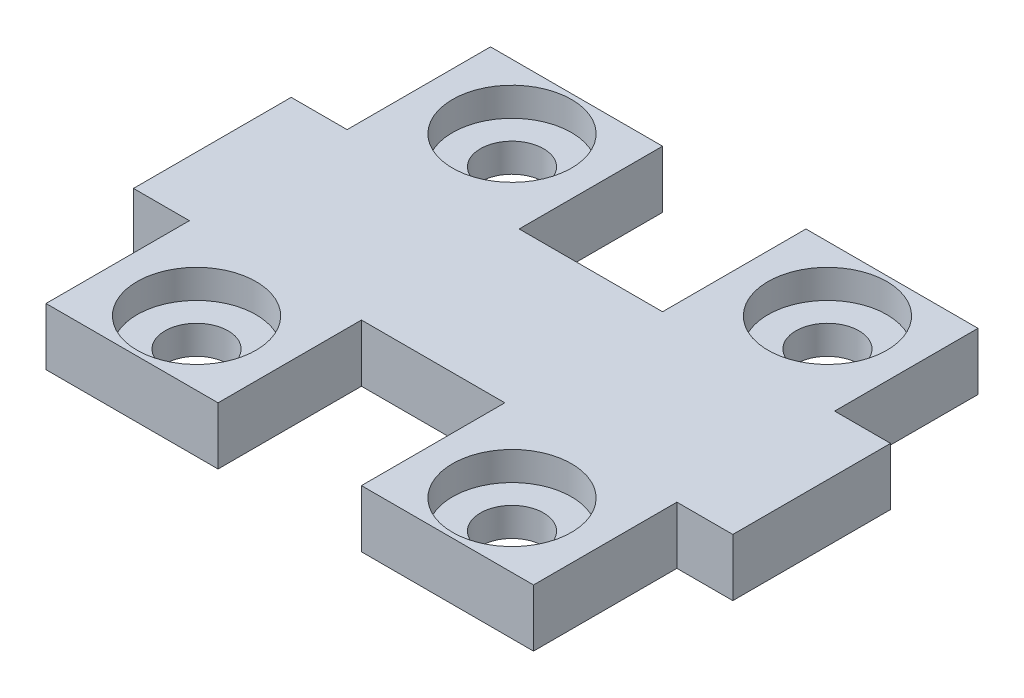
ISO-10303-21;
HEADER;
FILE_DESCRIPTION(('STEP AP214'),'2;1');
FILE_NAME('part.step','',(''),(''),'','','');
FILE_SCHEMA(('AUTOMOTIVE_DESIGN { 1 0 10303 214 1 1 1 1 }'));
ENDSEC;
DATA;
#1=APPLICATION_CONTEXT('core data for automotive mechanical design processes');
#2=APPLICATION_PROTOCOL_DEFINITION('international standard','automotive_design',2000,#1);
#3=PRODUCT_CONTEXT('',#1,'mechanical');
#4=PRODUCT('Part','Part','',(#3));
#5=PRODUCT_RELATED_PRODUCT_CATEGORY('part','',(#4));
#6=PRODUCT_DEFINITION_FORMATION('','',#4);
#7=PRODUCT_DEFINITION_CONTEXT('part definition',#1,'design');
#8=PRODUCT_DEFINITION('design','',#6,#7);
#9=PRODUCT_DEFINITION_SHAPE('','',#8);
#10=(LENGTH_UNIT() NAMED_UNIT(*) SI_UNIT(.MILLI.,.METRE.));
#11=(NAMED_UNIT(*) PLANE_ANGLE_UNIT() SI_UNIT($,.RADIAN.));
#12=(NAMED_UNIT(*) SI_UNIT($,.STERADIAN.) SOLID_ANGLE_UNIT());
#13=UNCERTAINTY_MEASURE_WITH_UNIT(LENGTH_MEASURE(1.E-05),#10,'distance_accuracy_value','');
#14=(GEOMETRIC_REPRESENTATION_CONTEXT(3) GLOBAL_UNCERTAINTY_ASSIGNED_CONTEXT((#13)) GLOBAL_UNIT_ASSIGNED_CONTEXT((#10,
#11,#12)) REPRESENTATION_CONTEXT('',''));
#15=CARTESIAN_POINT('',(0.,0.,0.));
#16=DIRECTION('',(0.,0.,1.));
#17=DIRECTION('',(1.,0.,0.));
#18=AXIS2_PLACEMENT_3D('',#15,#16,#17);
#19=CARTESIAN_POINT('',(58.9,4.,-13.0906004899504));
#20=DIRECTION('',(0.,1.,0.));
#21=DIRECTION('',(0.,0.,1.));
#22=AXIS2_PLACEMENT_3D('',#19,#20,#21);
#23=PLANE('',#22);
#24=DIRECTION('',(1.,0.,0.));
#25=VECTOR('',#24,1.);
#26=CARTESIAN_POINT('',(0.,4.,-13.0906004899504));
#27=LINE('',#26,#25);
#28=CARTESIAN_POINT('',(55.,4.,-13.0906004899504));
#29=VERTEX_POINT('',#28);
#30=CARTESIAN_POINT('',(58.9,4.,-13.0906004899504));
#31=VERTEX_POINT('',#30);
#32=EDGE_CURVE('E203',#29,#31,#27,.T.);
#33=ORIENTED_EDGE('',*,*,#32,.T.);
#34=DIRECTION('',(0.,0.,-1.));
#35=VECTOR('',#34,1.);
#36=CARTESIAN_POINT('',(58.9,4.,-3.09060048995041));
#37=LINE('',#36,#35);
#38=CARTESIAN_POINT('',(58.9,4.,-3.09060048995041));
#39=VERTEX_POINT('',#38);
#40=EDGE_CURVE('E239',#39,#31,#37,.T.);
#41=ORIENTED_EDGE('',*,*,#40,.F.);
#42=DIRECTION('',(-1.,0.,0.));
#43=VECTOR('',#42,1.);
#44=CARTESIAN_POINT('',(55.,4.,-3.09060048995041));
#45=LINE('',#44,#43);
#46=CARTESIAN_POINT('',(70.9,4.,-3.09060048995041));
#47=VERTEX_POINT('',#46);
#48=EDGE_CURVE('E321',#47,#39,#45,.T.);
#49=ORIENTED_EDGE('',*,*,#48,.F.);
#50=DIRECTION('',(0.,0.,1.));
#51=VECTOR('',#50,1.);
#52=CARTESIAN_POINT('',(70.9,4.,-13.0906004899504));
#53=LINE('',#52,#51);
#54=CARTESIAN_POINT('',(70.9,4.,-13.0906004899504));
#55=VERTEX_POINT('',#54);
#56=EDGE_CURVE('E277',#55,#47,#53,.T.);
#57=ORIENTED_EDGE('',*,*,#56,.F.);
#58=CARTESIAN_POINT('',(80.9,4.,-13.0906004899504));
#59=VERTEX_POINT('',#58);
#60=EDGE_CURVE('E201',#55,#59,#27,.T.);
#61=ORIENTED_EDGE('',*,*,#60,.T.);
#62=DIRECTION('',(0.,0.,-1.));
#63=VECTOR('',#62,1.);
#64=CARTESIAN_POINT('',(80.9,4.,-13.0906004899504));
#65=LINE('',#64,#63);
#66=CARTESIAN_POINT('',(80.9,4.,-3.09060048995041));
#67=VERTEX_POINT('',#66);
#68=EDGE_CURVE('E270',#67,#59,#65,.T.);
#69=ORIENTED_EDGE('',*,*,#68,.F.);
#70=CARTESIAN_POINT('',(92.9,4.,-3.09060048995041));
#71=VERTEX_POINT('',#70);
#72=EDGE_CURVE('E318',#71,#67,#45,.T.);
#73=ORIENTED_EDGE('',*,*,#72,.F.);
#74=DIRECTION('',(0.,0.,1.));
#75=VECTOR('',#74,1.);
#76=CARTESIAN_POINT('',(92.9,4.,-13.0906004899504));
#77=LINE('',#76,#75);
#78=CARTESIAN_POINT('',(92.9,4.,-13.0906004899504));
#79=VERTEX_POINT('',#78);
#80=EDGE_CURVE('E191',#79,#71,#77,.T.);
#81=ORIENTED_EDGE('',*,*,#80,.F.);
#82=CARTESIAN_POINT('',(96.8,4.,-13.0906004899504));
#83=VERTEX_POINT('',#82);
#84=EDGE_CURVE('E197',#79,#83,#27,.T.);
#85=ORIENTED_EDGE('',*,*,#84,.T.);
#86=DIRECTION('',(0.,0.,-1.));
#87=VECTOR('',#86,1.);
#88=CARTESIAN_POINT('',(96.8,4.,-3.09060048995041));
#89=LINE('',#88,#87);
#90=CARTESIAN_POINT('',(96.8,4.,-24.0906004899504));
#91=VERTEX_POINT('',#90);
#92=EDGE_CURVE('E196',#83,#91,#89,.T.);
#93=ORIENTED_EDGE('',*,*,#92,.T.);
#94=DIRECTION('',(-1.,0.,0.));
#95=VECTOR('',#94,1.);
#96=CARTESIAN_POINT('',(0.,4.,-24.0906004899504));
#97=LINE('',#96,#95);
#98=CARTESIAN_POINT('',(92.9,4.,-24.0906004899504));
#99=VERTEX_POINT('',#98);
#100=EDGE_CURVE('E186',#91,#99,#97,.T.);
#101=ORIENTED_EDGE('',*,*,#100,.T.);
#102=DIRECTION('',(0.,0.,1.));
#103=VECTOR('',#102,1.);
#104=CARTESIAN_POINT('',(92.9,4.,-34.0906004899504));
#105=LINE('',#104,#103);
#106=CARTESIAN_POINT('',(92.9,4.,-34.0906004899504));
#107=VERTEX_POINT('',#106);
#108=EDGE_CURVE('E169',#107,#99,#105,.T.);
#109=ORIENTED_EDGE('',*,*,#108,.F.);
#110=DIRECTION('',(-1.,0.,0.));
#111=VECTOR('',#110,1.);
#112=CARTESIAN_POINT('',(55.,4.,-34.0906004899504));
#113=LINE('',#112,#111);
#114=CARTESIAN_POINT('',(80.9,4.,-34.0906004899504));
#115=VERTEX_POINT('',#114);
#116=EDGE_CURVE('E357',#107,#115,#113,.T.);
#117=ORIENTED_EDGE('',*,*,#116,.T.);
#118=DIRECTION('',(0.,0.,-1.));
#119=VECTOR('',#118,1.);
#120=CARTESIAN_POINT('',(80.9,4.,-34.0906004899504));
#121=LINE('',#120,#119);
#122=CARTESIAN_POINT('',(80.9,4.,-24.0906004899504));
#123=VERTEX_POINT('',#122);
#124=EDGE_CURVE('E234',#123,#115,#121,.T.);
#125=ORIENTED_EDGE('',*,*,#124,.F.);
#126=CARTESIAN_POINT('',(70.9,4.,-24.0906004899504));
#127=VERTEX_POINT('',#126);
#128=EDGE_CURVE('E198',#123,#127,#97,.T.);
#129=ORIENTED_EDGE('',*,*,#128,.T.);
#130=DIRECTION('',(0.,0.,1.));
#131=VECTOR('',#130,1.);
#132=CARTESIAN_POINT('',(70.9,4.,-34.0906004899504));
#133=LINE('',#132,#131);
#134=CARTESIAN_POINT('',(70.9,4.,-34.0906004899504));
#135=VERTEX_POINT('',#134);
#136=EDGE_CURVE('E236',#135,#127,#133,.T.);
#137=ORIENTED_EDGE('',*,*,#136,.F.);
#138=CARTESIAN_POINT('',(58.9,4.,-34.0906004899504));
#139=VERTEX_POINT('',#138);
#140=EDGE_CURVE('E358',#135,#139,#113,.T.);
#141=ORIENTED_EDGE('',*,*,#140,.T.);
#142=DIRECTION('',(0.,0.,-1.));
#143=VECTOR('',#142,1.);
#144=CARTESIAN_POINT('',(58.9,4.,-34.0906004899504));
#145=LINE('',#144,#143);
#146=CARTESIAN_POINT('',(58.9,4.,-24.0906004899504));
#147=VERTEX_POINT('',#146);
#148=EDGE_CURVE('E256',#147,#139,#145,.T.);
#149=ORIENTED_EDGE('',*,*,#148,.F.);
#150=CARTESIAN_POINT('',(55.,4.,-24.0906004899504));
#151=VERTEX_POINT('',#150);
#152=EDGE_CURVE('E200',#147,#151,#97,.T.);
#153=ORIENTED_EDGE('',*,*,#152,.T.);
#154=DIRECTION('',(0.,0.,1.));
#155=VECTOR('',#154,1.);
#156=CARTESIAN_POINT('',(55.,4.,-3.09060048995041));
#157=LINE('',#156,#155);
#158=EDGE_CURVE('E207',#151,#29,#157,.T.);
#159=ORIENTED_EDGE('',*,*,#158,.T.);
#160=EDGE_LOOP('',(#33,#41,#49,#57,#61,#69,#73,#81,#85,#93,#101,#109,#117,#125,#129,#137,#141,
#149,#153,#159));
#161=FACE_BOUND('',#160,.T.);
#162=CARTESIAN_POINT('',(64.9,4.,-7.59060048995041));
#163=DIRECTION('',(0.,1.,0.));
#164=DIRECTION('',(0.,0.,1.));
#165=AXIS2_PLACEMENT_3D('',#162,#163,#164);
#166=CIRCLE('',#165,4.15);
#167=CARTESIAN_POINT('',(64.9,4.,-3.44060048995041));
#168=VERTEX_POINT('',#167);
#169=EDGE_CURVE('E347',#168,#168,#166,.T.);
#170=ORIENTED_EDGE('',*,*,#169,.F.);
#171=EDGE_LOOP('',(#170));
#172=FACE_BOUND('',#171,.T.);
#173=CARTESIAN_POINT('',(86.9,4.,-7.59060048995041));
#174=DIRECTION('',(0.,1.,0.));
#175=DIRECTION('',(0.,0.,1.));
#176=AXIS2_PLACEMENT_3D('',#173,#174,#175);
#177=CIRCLE('',#176,4.15);
#178=CARTESIAN_POINT('',(86.9,4.,-3.44060048995041));
#179=VERTEX_POINT('',#178);
#180=EDGE_CURVE('E344',#179,#179,#177,.T.);
#181=ORIENTED_EDGE('',*,*,#180,.F.);
#182=EDGE_LOOP('',(#181));
#183=FACE_BOUND('',#182,.T.);
#184=CARTESIAN_POINT('',(86.9,4.,-29.5906004899504));
#185=DIRECTION('',(0.,-1.,0.));
#186=DIRECTION('',(0.,0.,-1.));
#187=AXIS2_PLACEMENT_3D('',#184,#185,#186);
#188=CIRCLE('',#187,4.15);
#189=CARTESIAN_POINT('',(86.9,4.,-33.7406004899504));
#190=VERTEX_POINT('',#189);
#191=EDGE_CURVE('E216',#190,#190,#188,.T.);
#192=ORIENTED_EDGE('',*,*,#191,.T.);
#193=EDGE_LOOP('',(#192));
#194=FACE_BOUND('',#193,.T.);
#195=CARTESIAN_POINT('',(64.9,4.,-29.5906004899504));
#196=DIRECTION('',(0.,-1.,0.));
#197=DIRECTION('',(0.,0.,-1.));
#198=AXIS2_PLACEMENT_3D('',#195,#196,#197);
#199=CIRCLE('',#198,4.15);
#200=CARTESIAN_POINT('',(64.9,4.,-33.7406004899504));
#201=VERTEX_POINT('',#200);
#202=EDGE_CURVE('E373',#201,#201,#199,.T.);
#203=ORIENTED_EDGE('',*,*,#202,.T.);
#204=EDGE_LOOP('',(#203));
#205=FACE_BOUND('',#204,.T.);
#206=ADVANCED_FACE('F37',(#161,#172,#183,#194,#205),#23,.T.);
#207=CARTESIAN_POINT('',(86.9,40.,-7.59060048995041));
#208=DIRECTION('',(0.,-1.,0.));
#209=DIRECTION('',(0.,0.,-1.));
#210=AXIS2_PLACEMENT_3D('',#207,#208,#209);
#211=CYLINDRICAL_SURFACE('',#210,2.2);
#212=CARTESIAN_POINT('',(86.9,0.,-7.59060048995041));
#213=DIRECTION('',(0.,-1.,0.));
#214=DIRECTION('',(0.,0.,-1.));
#215=AXIS2_PLACEMENT_3D('',#212,#213,#214);
#216=CIRCLE('',#215,2.2);
#217=CARTESIAN_POINT('',(86.9,0.,-9.7906004899504));
#218=VERTEX_POINT('',#217);
#219=EDGE_CURVE('E334',#218,#218,#216,.T.);
#220=ORIENTED_EDGE('',*,*,#219,.T.);
#221=EDGE_LOOP('',(#220));
#222=FACE_BOUND('',#221,.T.);
#223=CARTESIAN_POINT('',(86.9,2.,-7.59060048995041));
#224=DIRECTION('',(0.,1.,0.));
#225=DIRECTION('',(0.,0.,1.));
#226=AXIS2_PLACEMENT_3D('',#223,#224,#225);
#227=CIRCLE('',#226,2.2);
#228=CARTESIAN_POINT('',(86.9,2.,-5.39060048995041));
#229=VERTEX_POINT('',#228);
#230=EDGE_CURVE('E337',#229,#229,#227,.F.);
#231=ORIENTED_EDGE('',*,*,#230,.F.);
#232=EDGE_LOOP('',(#231));
#233=FACE_BOUND('',#232,.T.);
#234=ADVANCED_FACE('F436',(#222,#233),#211,.F.);
#235=CARTESIAN_POINT('',(64.9,40.,-7.59060048995041));
#236=DIRECTION('',(0.,-1.,0.));
#237=DIRECTION('',(0.,0.,-1.));
#238=AXIS2_PLACEMENT_3D('',#235,#236,#237);
#239=CYLINDRICAL_SURFACE('',#238,2.2);
#240=CARTESIAN_POINT('',(64.9,0.,-7.59060048995041));
#241=DIRECTION('',(0.,-1.,0.));
#242=DIRECTION('',(0.,0.,-1.));
#243=AXIS2_PLACEMENT_3D('',#240,#241,#242);
#244=CIRCLE('',#243,2.2);
#245=CARTESIAN_POINT('',(64.9,0.,-9.7906004899504));
#246=VERTEX_POINT('',#245);
#247=EDGE_CURVE('E333',#246,#246,#244,.T.);
#248=ORIENTED_EDGE('',*,*,#247,.T.);
#249=EDGE_LOOP('',(#248));
#250=FACE_BOUND('',#249,.T.);
#251=CARTESIAN_POINT('',(64.9,2.,-7.59060048995041));
#252=DIRECTION('',(0.,1.,0.));
#253=DIRECTION('',(0.,0.,1.));
#254=AXIS2_PLACEMENT_3D('',#251,#252,#253);
#255=CIRCLE('',#254,2.2);
#256=CARTESIAN_POINT('',(64.9,2.,-5.39060048995041));
#257=VERTEX_POINT('',#256);
#258=EDGE_CURVE('E353',#257,#257,#255,.F.);
#259=ORIENTED_EDGE('',*,*,#258,.F.);
#260=EDGE_LOOP('',(#259));
#261=FACE_BOUND('',#260,.T.);
#262=ADVANCED_FACE('F456',(#250,#261),#239,.F.);
#263=CARTESIAN_POINT('',(86.9,40.,-29.5906004899504));
#264=DIRECTION('',(0.,-1.,0.));
#265=DIRECTION('',(0.,0.,-1.));
#266=AXIS2_PLACEMENT_3D('',#263,#264,#265);
#267=CYLINDRICAL_SURFACE('',#266,2.2);
#268=CARTESIAN_POINT('',(86.9,0.,-29.5906004899504));
#269=DIRECTION('',(0.,1.,0.));
#270=DIRECTION('',(0.,0.,1.));
#271=AXIS2_PLACEMENT_3D('',#268,#269,#270);
#272=CIRCLE('',#271,2.2);
#273=CARTESIAN_POINT('',(86.9,0.,-27.3906004899504));
#274=VERTEX_POINT('',#273);
#275=EDGE_CURVE('E362',#274,#274,#272,.T.);
#276=ORIENTED_EDGE('',*,*,#275,.F.);
#277=EDGE_LOOP('',(#276));
#278=FACE_BOUND('',#277,.T.);
#279=CARTESIAN_POINT('',(86.9,2.,-29.5906004899504));
#280=DIRECTION('',(0.,1.,0.));
#281=DIRECTION('',(0.,0.,1.));
#282=AXIS2_PLACEMENT_3D('',#279,#280,#281);
#283=CIRCLE('',#282,2.2);
#284=CARTESIAN_POINT('',(86.9,2.,-27.3906004899504));
#285=VERTEX_POINT('',#284);
#286=EDGE_CURVE('E365',#285,#285,#283,.T.);
#287=ORIENTED_EDGE('',*,*,#286,.T.);
#288=EDGE_LOOP('',(#287));
#289=FACE_BOUND('',#288,.T.);
#290=ADVANCED_FACE('F418',(#278,#289),#267,.F.);
#291=CARTESIAN_POINT('',(64.9,40.,-29.5906004899504));
#292=DIRECTION('',(0.,-1.,0.));
#293=DIRECTION('',(0.,0.,-1.));
#294=AXIS2_PLACEMENT_3D('',#291,#292,#293);
#295=CYLINDRICAL_SURFACE('',#294,2.2);
#296=CARTESIAN_POINT('',(64.9,0.,-29.5906004899504));
#297=DIRECTION('',(0.,1.,0.));
#298=DIRECTION('',(0.,0.,1.));
#299=AXIS2_PLACEMENT_3D('',#296,#297,#298);
#300=CIRCLE('',#299,2.2);
#301=CARTESIAN_POINT('',(64.9,0.,-27.3906004899504));
#302=VERTEX_POINT('',#301);
#303=EDGE_CURVE('E361',#302,#302,#300,.T.);
#304=ORIENTED_EDGE('',*,*,#303,.F.);
#305=EDGE_LOOP('',(#304));
#306=FACE_BOUND('',#305,.T.);
#307=CARTESIAN_POINT('',(64.9,2.,-29.5906004899504));
#308=DIRECTION('',(0.,1.,0.));
#309=DIRECTION('',(0.,0.,1.));
#310=AXIS2_PLACEMENT_3D('',#307,#308,#309);
#311=CIRCLE('',#310,2.2);
#312=CARTESIAN_POINT('',(64.9,2.,-27.3906004899504));
#313=VERTEX_POINT('',#312);
#314=EDGE_CURVE('E379',#313,#313,#311,.T.);
#315=ORIENTED_EDGE('',*,*,#314,.T.);
#316=EDGE_LOOP('',(#315));
#317=FACE_BOUND('',#316,.T.);
#318=ADVANCED_FACE('F483',(#306,#317),#295,.F.);
#319=CARTESIAN_POINT('',(0.,40.,-24.0906004899504));
#320=DIRECTION('',(0.,0.,1.));
#321=DIRECTION('',(1.,0.,0.));
#322=AXIS2_PLACEMENT_3D('',#319,#320,#321);
#323=PLANE('',#322);
#324=ORIENTED_EDGE('',*,*,#128,.F.);
#325=DIRECTION('',(0.,1.,0.));
#326=VECTOR('',#325,1.);
#327=CARTESIAN_POINT('',(80.9,0.,-24.0906004899504));
#328=LINE('',#327,#326);
#329=CARTESIAN_POINT('',(80.9,0.,-24.0906004899504));
#330=VERTEX_POINT('',#329);
#331=EDGE_CURVE('E230',#330,#123,#328,.T.);
#332=ORIENTED_EDGE('',*,*,#331,.F.);
#333=DIRECTION('',(1.,0.,0.));
#334=VECTOR('',#333,1.);
#335=CARTESIAN_POINT('',(70.9,0.,-24.0906004899504));
#336=LINE('',#335,#334);
#337=CARTESIAN_POINT('',(70.9,0.,-24.0906004899504));
#338=VERTEX_POINT('',#337);
#339=EDGE_CURVE('E243',#338,#330,#336,.T.);
#340=ORIENTED_EDGE('',*,*,#339,.F.);
#341=DIRECTION('',(0.,1.,0.));
#342=VECTOR('',#341,1.);
#343=CARTESIAN_POINT('',(70.9,0.,-24.0906004899504));
#344=LINE('',#343,#342);
#345=EDGE_CURVE('E244',#338,#127,#344,.T.);
#346=ORIENTED_EDGE('',*,*,#345,.T.);
#347=EDGE_LOOP('',(#324,#332,#340,#346));
#348=FACE_BOUND('',#347,.T.);
#349=ADVANCED_FACE('F388',(#348),#323,.F.);
#350=CARTESIAN_POINT('',(0.,0.,-34.0906004899504));
#351=DIRECTION('',(0.,0.,1.));
#352=DIRECTION('',(-1.,0.,0.));
#353=AXIS2_PLACEMENT_3D('',#350,#351,#352);
#354=PLANE('',#353);
#355=ORIENTED_EDGE('',*,*,#116,.F.);
#356=DIRECTION('',(0.,1.,0.));
#357=VECTOR('',#356,1.);
#358=CARTESIAN_POINT('',(92.9,0.,-34.0906004899504));
#359=LINE('',#358,#357);
#360=CARTESIAN_POINT('',(92.9,0.,-34.0906004899504));
#361=VERTEX_POINT('',#360);
#362=EDGE_CURVE('E175',#361,#107,#359,.T.);
#363=ORIENTED_EDGE('',*,*,#362,.F.);
#364=DIRECTION('',(1.,0.,0.));
#365=VECTOR('',#364,1.);
#366=CARTESIAN_POINT('',(55.,0.,-34.0906004899504));
#367=LINE('',#366,#365);
#368=CARTESIAN_POINT('',(80.9,0.,-34.0906004899504));
#369=VERTEX_POINT('',#368);
#370=EDGE_CURVE('E354',#369,#361,#367,.T.);
#371=ORIENTED_EDGE('',*,*,#370,.F.);
#372=DIRECTION('',(0.,1.,0.));
#373=VECTOR('',#372,1.);
#374=CARTESIAN_POINT('',(80.9,0.,-34.0906004899504));
#375=LINE('',#374,#373);
#376=EDGE_CURVE('E224',#369,#115,#375,.T.);
#377=ORIENTED_EDGE('',*,*,#376,.T.);
#378=EDGE_LOOP('',(#355,#363,#371,#377));
#379=FACE_BOUND('',#378,.T.);
#380=ADVANCED_FACE('F391',(#379),#354,.F.);
#381=ORIENTED_EDGE('',*,*,#152,.F.);
#382=DIRECTION('',(0.,1.,0.));
#383=VECTOR('',#382,1.);
#384=CARTESIAN_POINT('',(58.9,0.,-24.0906004899504));
#385=LINE('',#384,#383);
#386=CARTESIAN_POINT('',(58.9,0.,-24.0906004899504));
#387=VERTEX_POINT('',#386);
#388=EDGE_CURVE('E259',#387,#147,#385,.T.);
#389=ORIENTED_EDGE('',*,*,#388,.F.);
#390=DIRECTION('',(1.,0.,0.));
#391=VECTOR('',#390,1.);
#392=CARTESIAN_POINT('',(55.,0.,-24.0906004899504));
#393=LINE('',#392,#391);
#394=CARTESIAN_POINT('',(55.,0.,-24.0906004899504));
#395=VERTEX_POINT('',#394);
#396=EDGE_CURVE('E252',#395,#387,#393,.T.);
#397=ORIENTED_EDGE('',*,*,#396,.F.);
#398=DIRECTION('',(0.,-1.,0.));
#399=VECTOR('',#398,1.);
#400=CARTESIAN_POINT('',(55.,0.,-24.0906004899504));
#401=LINE('',#400,#399);
#402=EDGE_CURVE('E41',#151,#395,#401,.T.);
#403=ORIENTED_EDGE('',*,*,#402,.F.);
#404=EDGE_LOOP('',(#381,#389,#397,#403));
#405=FACE_BOUND('',#404,.T.);
#406=ADVANCED_FACE('F405',(#405),#323,.F.);
#407=CARTESIAN_POINT('',(0.,40.,-13.0906004899504));
#408=DIRECTION('',(0.,0.,-1.));
#409=DIRECTION('',(-1.,0.,0.));
#410=AXIS2_PLACEMENT_3D('',#407,#408,#409);
#411=PLANE('',#410);
#412=ORIENTED_EDGE('',*,*,#84,.F.);
#413=DIRECTION('',(0.,1.,0.));
#414=VECTOR('',#413,1.);
#415=CARTESIAN_POINT('',(92.9,0.,-13.0906004899504));
#416=LINE('',#415,#414);
#417=CARTESIAN_POINT('',(92.9,0.,-13.0906004899504));
#418=VERTEX_POINT('',#417);
#419=EDGE_CURVE('E47',#418,#79,#416,.T.);
#420=ORIENTED_EDGE('',*,*,#419,.F.);
#421=DIRECTION('',(-1.,0.,0.));
#422=VECTOR('',#421,1.);
#423=CARTESIAN_POINT('',(96.8,0.,-13.0906004899504));
#424=LINE('',#423,#422);
#425=CARTESIAN_POINT('',(96.8,0.,-13.0906004899504));
#426=VERTEX_POINT('',#425);
#427=EDGE_CURVE('E303',#426,#418,#424,.T.);
#428=ORIENTED_EDGE('',*,*,#427,.F.);
#429=DIRECTION('',(0.,1.,0.));
#430=VECTOR('',#429,1.);
#431=CARTESIAN_POINT('',(96.8,40.,-13.0906004899504));
#432=LINE('',#431,#430);
#433=EDGE_CURVE('E213',#426,#83,#432,.T.);
#434=ORIENTED_EDGE('',*,*,#433,.T.);
#435=EDGE_LOOP('',(#412,#420,#428,#434));
#436=FACE_BOUND('',#435,.T.);
#437=ADVANCED_FACE('F515',(#436),#411,.F.);
#438=CARTESIAN_POINT('',(0.,0.,-3.09060048995041));
#439=DIRECTION('',(0.,0.,-1.));
#440=DIRECTION('',(-1.,0.,0.));
#441=AXIS2_PLACEMENT_3D('',#438,#439,#440);
#442=PLANE('',#441);
#443=ORIENTED_EDGE('',*,*,#72,.T.);
#444=DIRECTION('',(0.,1.,0.));
#445=VECTOR('',#444,1.);
#446=CARTESIAN_POINT('',(80.9,0.,-3.09060048995041));
#447=LINE('',#446,#445);
#448=CARTESIAN_POINT('',(80.9,0.,-3.09060048995041));
#449=VERTEX_POINT('',#448);
#450=EDGE_CURVE('E287',#449,#67,#447,.T.);
#451=ORIENTED_EDGE('',*,*,#450,.F.);
#452=DIRECTION('',(1.,0.,0.));
#453=VECTOR('',#452,1.);
#454=CARTESIAN_POINT('',(55.,0.,-3.09060048995041));
#455=LINE('',#454,#453);
#456=CARTESIAN_POINT('',(92.9,0.,-3.09060048995041));
#457=VERTEX_POINT('',#456);
#458=EDGE_CURVE('E330',#449,#457,#455,.T.);
#459=ORIENTED_EDGE('',*,*,#458,.T.);
#460=DIRECTION('',(0.,1.,0.));
#461=VECTOR('',#460,1.);
#462=CARTESIAN_POINT('',(92.9,0.,-3.09060048995041));
#463=LINE('',#462,#461);
#464=EDGE_CURVE('E11',#457,#71,#463,.T.);
#465=ORIENTED_EDGE('',*,*,#464,.T.);
#466=EDGE_LOOP('',(#443,#451,#459,#465));
#467=FACE_BOUND('',#466,.T.);
#468=ADVANCED_FACE('F466',(#467),#442,.F.);
#469=ORIENTED_EDGE('',*,*,#48,.T.);
#470=DIRECTION('',(0.,1.,0.));
#471=VECTOR('',#470,1.);
#472=CARTESIAN_POINT('',(58.9,0.,-3.09060048995041));
#473=LINE('',#472,#471);
#474=CARTESIAN_POINT('',(58.9,0.,-3.09060048995041));
#475=VERTEX_POINT('',#474);
#476=EDGE_CURVE('E297',#475,#39,#473,.T.);
#477=ORIENTED_EDGE('',*,*,#476,.F.);
#478=CARTESIAN_POINT('',(70.9,0.,-3.09060048995041));
#479=VERTEX_POINT('',#478);
#480=EDGE_CURVE('E325',#475,#479,#455,.T.);
#481=ORIENTED_EDGE('',*,*,#480,.T.);
#482=DIRECTION('',(0.,1.,0.));
#483=VECTOR('',#482,1.);
#484=CARTESIAN_POINT('',(70.9,0.,-3.09060048995041));
#485=LINE('',#484,#483);
#486=EDGE_CURVE('E276',#479,#47,#485,.T.);
#487=ORIENTED_EDGE('',*,*,#486,.T.);
#488=EDGE_LOOP('',(#469,#477,#481,#487));
#489=FACE_BOUND('',#488,.T.);
#490=ADVANCED_FACE('F499',(#489),#442,.F.);
#491=CARTESIAN_POINT('',(0.,0.,0.));
#492=DIRECTION('',(0.,1.,0.));
#493=DIRECTION('',(0.,0.,1.));
#494=AXIS2_PLACEMENT_3D('',#491,#492,#493);
#495=PLANE('',#494);
#496=DIRECTION('',(0.,0.,-1.));
#497=VECTOR('',#496,1.);
#498=CARTESIAN_POINT('',(58.9,0.,-3.09060048995041));
#499=LINE('',#498,#497);
#500=CARTESIAN_POINT('',(58.9,0.,-13.0906004899504));
#501=VERTEX_POINT('',#500);
#502=EDGE_CURVE('E291',#475,#501,#499,.T.);
#503=ORIENTED_EDGE('',*,*,#502,.T.);
#504=DIRECTION('',(-1.,0.,0.));
#505=VECTOR('',#504,1.);
#506=CARTESIAN_POINT('',(55.,0.,-13.0906004899504));
#507=LINE('',#506,#505);
#508=CARTESIAN_POINT('',(55.,0.,-13.0906004899504));
#509=VERTEX_POINT('',#508);
#510=EDGE_CURVE('E294',#501,#509,#507,.T.);
#511=ORIENTED_EDGE('',*,*,#510,.T.);
#512=DIRECTION('',(0.,0.,-1.));
#513=VECTOR('',#512,1.);
#514=CARTESIAN_POINT('',(55.,0.,-3.09060048995041));
#515=LINE('',#514,#513);
#516=EDGE_CURVE('E326',#509,#395,#515,.T.);
#517=ORIENTED_EDGE('',*,*,#516,.T.);
#518=ORIENTED_EDGE('',*,*,#396,.T.);
#519=DIRECTION('',(0.,0.,-1.));
#520=VECTOR('',#519,1.);
#521=CARTESIAN_POINT('',(58.9,0.,-34.0906004899504));
#522=LINE('',#521,#520);
#523=CARTESIAN_POINT('',(58.9,0.,-34.0906004899504));
#524=VERTEX_POINT('',#523);
#525=EDGE_CURVE('E255',#387,#524,#522,.T.);
#526=ORIENTED_EDGE('',*,*,#525,.T.);
#527=CARTESIAN_POINT('',(70.9,0.,-34.0906004899504));
#528=VERTEX_POINT('',#527);
#529=EDGE_CURVE('E343',#524,#528,#367,.T.);
#530=ORIENTED_EDGE('',*,*,#529,.T.);
#531=DIRECTION('',(0.,0.,1.));
#532=VECTOR('',#531,1.);
#533=CARTESIAN_POINT('',(70.9,0.,-34.0906004899504));
#534=LINE('',#533,#532);
#535=EDGE_CURVE('E237',#528,#338,#534,.T.);
#536=ORIENTED_EDGE('',*,*,#535,.T.);
#537=ORIENTED_EDGE('',*,*,#339,.T.);
#538=DIRECTION('',(0.,0.,-1.));
#539=VECTOR('',#538,1.);
#540=CARTESIAN_POINT('',(80.9,0.,-34.0906004899504));
#541=LINE('',#540,#539);
#542=EDGE_CURVE('E240',#330,#369,#541,.T.);
#543=ORIENTED_EDGE('',*,*,#542,.T.);
#544=ORIENTED_EDGE('',*,*,#370,.T.);
#545=DIRECTION('',(0.,0.,1.));
#546=VECTOR('',#545,1.);
#547=CARTESIAN_POINT('',(92.9,0.,-34.0906004899504));
#548=LINE('',#547,#546);
#549=CARTESIAN_POINT('',(92.9,0.,-24.0906004899504));
#550=VERTEX_POINT('',#549);
#551=EDGE_CURVE('E180',#361,#550,#548,.T.);
#552=ORIENTED_EDGE('',*,*,#551,.T.);
#553=DIRECTION('',(1.,0.,0.));
#554=VECTOR('',#553,1.);
#555=CARTESIAN_POINT('',(96.8,0.,-24.0906004899504));
#556=LINE('',#555,#554);
#557=CARTESIAN_POINT('',(96.8,0.,-24.0906004899504));
#558=VERTEX_POINT('',#557);
#559=EDGE_CURVE('E189',#550,#558,#556,.T.);
#560=ORIENTED_EDGE('',*,*,#559,.T.);
#561=DIRECTION('',(0.,0.,-1.));
#562=VECTOR('',#561,1.);
#563=CARTESIAN_POINT('',(96.8,0.,-3.09060048995041));
#564=LINE('',#563,#562);
#565=EDGE_CURVE('E322',#426,#558,#564,.T.);
#566=ORIENTED_EDGE('',*,*,#565,.F.);
#567=ORIENTED_EDGE('',*,*,#427,.T.);
#568=DIRECTION('',(0.,0.,1.));
#569=VECTOR('',#568,1.);
#570=CARTESIAN_POINT('',(92.9,0.,-13.0906004899504));
#571=LINE('',#570,#569);
#572=EDGE_CURVE('E306',#418,#457,#571,.T.);
#573=ORIENTED_EDGE('',*,*,#572,.T.);
#574=ORIENTED_EDGE('',*,*,#458,.F.);
#575=DIRECTION('',(0.,0.,-1.));
#576=VECTOR('',#575,1.);
#577=CARTESIAN_POINT('',(80.9,0.,-13.0906004899504));
#578=LINE('',#577,#576);
#579=CARTESIAN_POINT('',(80.9,0.,-13.0906004899504));
#580=VERTEX_POINT('',#579);
#581=EDGE_CURVE('E269',#449,#580,#578,.T.);
#582=ORIENTED_EDGE('',*,*,#581,.T.);
#583=DIRECTION('',(-1.,0.,0.));
#584=VECTOR('',#583,1.);
#585=CARTESIAN_POINT('',(70.9,0.,-13.0906004899504));
#586=LINE('',#585,#584);
#587=CARTESIAN_POINT('',(70.9,0.,-13.0906004899504));
#588=VERTEX_POINT('',#587);
#589=EDGE_CURVE('E273',#580,#588,#586,.T.);
#590=ORIENTED_EDGE('',*,*,#589,.T.);
#591=DIRECTION('',(0.,0.,1.));
#592=VECTOR('',#591,1.);
#593=CARTESIAN_POINT('',(70.9,0.,-13.0906004899504));
#594=LINE('',#593,#592);
#595=EDGE_CURVE('E266',#588,#479,#594,.T.);
#596=ORIENTED_EDGE('',*,*,#595,.T.);
#597=ORIENTED_EDGE('',*,*,#480,.F.);
#598=EDGE_LOOP('',(#503,#511,#517,#518,#526,#530,#536,#537,#543,#544,#552,#560,#566,#567,#573,
#574,#582,#590,#596,#597));
#599=FACE_BOUND('',#598,.T.);
#600=ORIENTED_EDGE('',*,*,#303,.T.);
#601=EDGE_LOOP('',(#600));
#602=FACE_BOUND('',#601,.T.);
#603=ORIENTED_EDGE('',*,*,#275,.T.);
#604=EDGE_LOOP('',(#603));
#605=FACE_BOUND('',#604,.T.);
#606=ORIENTED_EDGE('',*,*,#247,.F.);
#607=EDGE_LOOP('',(#606));
#608=FACE_BOUND('',#607,.T.);
#609=ORIENTED_EDGE('',*,*,#219,.F.);
#610=EDGE_LOOP('',(#609));
#611=FACE_BOUND('',#610,.T.);
#612=ADVANCED_FACE('F394',(#599,#602,#605,#608,#611),#495,.F.);
#613=ORIENTED_EDGE('',*,*,#32,.F.);
#614=DIRECTION('',(0.,-1.,0.));
#615=VECTOR('',#614,1.);
#616=CARTESIAN_POINT('',(55.,40.,-13.0906004899504));
#617=LINE('',#616,#615);
#618=EDGE_CURVE('E215',#29,#509,#617,.T.);
#619=ORIENTED_EDGE('',*,*,#618,.T.);
#620=ORIENTED_EDGE('',*,*,#510,.F.);
#621=DIRECTION('',(0.,1.,0.));
#622=VECTOR('',#621,1.);
#623=CARTESIAN_POINT('',(58.9,0.,-13.0906004899504));
#624=LINE('',#623,#622);
#625=EDGE_CURVE('E279',#501,#31,#624,.T.);
#626=ORIENTED_EDGE('',*,*,#625,.T.);
#627=EDGE_LOOP('',(#613,#619,#620,#626));
#628=FACE_BOUND('',#627,.T.);
#629=ADVANCED_FACE('F498',(#628),#411,.F.);
#630=CARTESIAN_POINT('',(58.9,0.,-3.09060048995041));
#631=DIRECTION('',(1.,0.,0.));
#632=DIRECTION('',(0.,0.,-1.));
#633=AXIS2_PLACEMENT_3D('',#630,#631,#632);
#634=PLANE('',#633);
#635=ORIENTED_EDGE('',*,*,#40,.T.);
#636=ORIENTED_EDGE('',*,*,#625,.F.);
#637=ORIENTED_EDGE('',*,*,#502,.F.);
#638=ORIENTED_EDGE('',*,*,#476,.T.);
#639=EDGE_LOOP('',(#635,#636,#637,#638));
#640=FACE_BOUND('',#639,.T.);
#641=ADVANCED_FACE('F512',(#640),#634,.F.);
#642=ORIENTED_EDGE('',*,*,#60,.F.);
#643=DIRECTION('',(0.,1.,0.));
#644=VECTOR('',#643,1.);
#645=CARTESIAN_POINT('',(70.9,0.,-13.0906004899504));
#646=LINE('',#645,#644);
#647=EDGE_CURVE('E261',#588,#55,#646,.T.);
#648=ORIENTED_EDGE('',*,*,#647,.F.);
#649=ORIENTED_EDGE('',*,*,#589,.F.);
#650=DIRECTION('',(0.,1.,0.));
#651=VECTOR('',#650,1.);
#652=CARTESIAN_POINT('',(80.9,0.,-13.0906004899504));
#653=LINE('',#652,#651);
#654=EDGE_CURVE('E284',#580,#59,#653,.T.);
#655=ORIENTED_EDGE('',*,*,#654,.T.);
#656=EDGE_LOOP('',(#642,#648,#649,#655));
#657=FACE_BOUND('',#656,.T.);
#658=ADVANCED_FACE('F516',(#657),#411,.F.);
#659=CARTESIAN_POINT('',(80.9,0.,-13.0906004899504));
#660=DIRECTION('',(1.,0.,0.));
#661=DIRECTION('',(0.,0.,-1.));
#662=AXIS2_PLACEMENT_3D('',#659,#660,#661);
#663=PLANE('',#662);
#664=ORIENTED_EDGE('',*,*,#68,.T.);
#665=ORIENTED_EDGE('',*,*,#654,.F.);
#666=ORIENTED_EDGE('',*,*,#581,.F.);
#667=ORIENTED_EDGE('',*,*,#450,.T.);
#668=EDGE_LOOP('',(#664,#665,#666,#667));
#669=FACE_BOUND('',#668,.T.);
#670=ADVANCED_FACE('F535',(#669),#663,.F.);
#671=CARTESIAN_POINT('',(70.9,0.,-13.0906004899504));
#672=DIRECTION('',(-1.,0.,0.));
#673=DIRECTION('',(0.,0.,1.));
#674=AXIS2_PLACEMENT_3D('',#671,#672,#673);
#675=PLANE('',#674);
#676=ORIENTED_EDGE('',*,*,#56,.T.);
#677=ORIENTED_EDGE('',*,*,#486,.F.);
#678=ORIENTED_EDGE('',*,*,#595,.F.);
#679=ORIENTED_EDGE('',*,*,#647,.T.);
#680=EDGE_LOOP('',(#676,#677,#678,#679));
#681=FACE_BOUND('',#680,.T.);
#682=ADVANCED_FACE('F532',(#681),#675,.F.);
#683=CARTESIAN_POINT('',(92.9,0.,-13.0906004899504));
#684=DIRECTION('',(-1.,0.,0.));
#685=DIRECTION('',(0.,0.,1.));
#686=AXIS2_PLACEMENT_3D('',#683,#684,#685);
#687=PLANE('',#686);
#688=ORIENTED_EDGE('',*,*,#80,.T.);
#689=ORIENTED_EDGE('',*,*,#464,.F.);
#690=ORIENTED_EDGE('',*,*,#572,.F.);
#691=ORIENTED_EDGE('',*,*,#419,.T.);
#692=EDGE_LOOP('',(#688,#689,#690,#691));
#693=FACE_BOUND('',#692,.T.);
#694=ADVANCED_FACE('F311',(#693),#687,.F.);
#695=ORIENTED_EDGE('',*,*,#529,.F.);
#696=DIRECTION('',(0.,1.,0.));
#697=VECTOR('',#696,1.);
#698=CARTESIAN_POINT('',(58.9,0.,-34.0906004899504));
#699=LINE('',#698,#697);
#700=EDGE_CURVE('E181',#524,#139,#699,.T.);
#701=ORIENTED_EDGE('',*,*,#700,.T.);
#702=ORIENTED_EDGE('',*,*,#140,.F.);
#703=DIRECTION('',(0.,1.,0.));
#704=VECTOR('',#703,1.);
#705=CARTESIAN_POINT('',(70.9,0.,-34.0906004899504));
#706=LINE('',#705,#704);
#707=EDGE_CURVE('E220',#528,#135,#706,.T.);
#708=ORIENTED_EDGE('',*,*,#707,.F.);
#709=EDGE_LOOP('',(#695,#701,#702,#708));
#710=FACE_BOUND('',#709,.T.);
#711=ADVANCED_FACE('F400',(#710),#354,.F.);
#712=CARTESIAN_POINT('',(58.9,0.,-34.0906004899504));
#713=DIRECTION('',(1.,0.,0.));
#714=DIRECTION('',(0.,0.,-1.));
#715=AXIS2_PLACEMENT_3D('',#712,#713,#714);
#716=PLANE('',#715);
#717=ORIENTED_EDGE('',*,*,#148,.T.);
#718=ORIENTED_EDGE('',*,*,#700,.F.);
#719=ORIENTED_EDGE('',*,*,#525,.F.);
#720=ORIENTED_EDGE('',*,*,#388,.T.);
#721=EDGE_LOOP('',(#717,#718,#719,#720));
#722=FACE_BOUND('',#721,.T.);
#723=ADVANCED_FACE('F403',(#722),#716,.F.);
#724=ORIENTED_EDGE('',*,*,#100,.F.);
#725=DIRECTION('',(0.,1.,0.));
#726=VECTOR('',#725,1.);
#727=CARTESIAN_POINT('',(96.8,30.,-24.0906004899504));
#728=LINE('',#727,#726);
#729=EDGE_CURVE('E217',#558,#91,#728,.T.);
#730=ORIENTED_EDGE('',*,*,#729,.F.);
#731=ORIENTED_EDGE('',*,*,#559,.F.);
#732=DIRECTION('',(0.,1.,0.));
#733=VECTOR('',#732,1.);
#734=CARTESIAN_POINT('',(92.9,0.,-24.0906004899504));
#735=LINE('',#734,#733);
#736=EDGE_CURVE('E172',#550,#99,#735,.T.);
#737=ORIENTED_EDGE('',*,*,#736,.T.);
#738=EDGE_LOOP('',(#724,#730,#731,#737));
#739=FACE_BOUND('',#738,.T.);
#740=ADVANCED_FACE('F185',(#739),#323,.F.);
#741=CARTESIAN_POINT('',(92.9,0.,-34.0906004899504));
#742=DIRECTION('',(-1.,0.,0.));
#743=DIRECTION('',(0.,0.,1.));
#744=AXIS2_PLACEMENT_3D('',#741,#742,#743);
#745=PLANE('',#744);
#746=ORIENTED_EDGE('',*,*,#108,.T.);
#747=ORIENTED_EDGE('',*,*,#736,.F.);
#748=ORIENTED_EDGE('',*,*,#551,.F.);
#749=ORIENTED_EDGE('',*,*,#362,.T.);
#750=EDGE_LOOP('',(#746,#747,#748,#749));
#751=FACE_BOUND('',#750,.T.);
#752=ADVANCED_FACE('F171',(#751),#745,.F.);
#753=CARTESIAN_POINT('',(80.9,0.,-34.0906004899504));
#754=DIRECTION('',(1.,0.,0.));
#755=DIRECTION('',(0.,0.,-1.));
#756=AXIS2_PLACEMENT_3D('',#753,#754,#755);
#757=PLANE('',#756);
#758=ORIENTED_EDGE('',*,*,#124,.T.);
#759=ORIENTED_EDGE('',*,*,#376,.F.);
#760=ORIENTED_EDGE('',*,*,#542,.F.);
#761=ORIENTED_EDGE('',*,*,#331,.T.);
#762=EDGE_LOOP('',(#758,#759,#760,#761));
#763=FACE_BOUND('',#762,.T.);
#764=ADVANCED_FACE('F385',(#763),#757,.F.);
#765=CARTESIAN_POINT('',(70.9,0.,-34.0906004899504));
#766=DIRECTION('',(-1.,0.,0.));
#767=DIRECTION('',(0.,0.,1.));
#768=AXIS2_PLACEMENT_3D('',#765,#766,#767);
#769=PLANE('',#768);
#770=ORIENTED_EDGE('',*,*,#136,.T.);
#771=ORIENTED_EDGE('',*,*,#345,.F.);
#772=ORIENTED_EDGE('',*,*,#535,.F.);
#773=ORIENTED_EDGE('',*,*,#707,.T.);
#774=EDGE_LOOP('',(#770,#771,#772,#773));
#775=FACE_BOUND('',#774,.T.);
#776=ADVANCED_FACE('F398',(#775),#769,.F.);
#777=CARTESIAN_POINT('',(96.8,0.,-3.09060048995041));
#778=DIRECTION('',(-1.,0.,0.));
#779=DIRECTION('',(0.,0.,1.));
#780=AXIS2_PLACEMENT_3D('',#777,#778,#779);
#781=PLANE('',#780);
#782=ORIENTED_EDGE('',*,*,#92,.F.);
#783=ORIENTED_EDGE('',*,*,#433,.F.);
#784=ORIENTED_EDGE('',*,*,#565,.T.);
#785=ORIENTED_EDGE('',*,*,#729,.T.);
#786=EDGE_LOOP('',(#782,#783,#784,#785));
#787=FACE_BOUND('',#786,.T.);
#788=ADVANCED_FACE('F39',(#787),#781,.F.);
#789=CARTESIAN_POINT('',(55.,0.,-3.09060048995041));
#790=DIRECTION('',(1.,0.,0.));
#791=DIRECTION('',(0.,0.,-1.));
#792=AXIS2_PLACEMENT_3D('',#789,#790,#791);
#793=PLANE('',#792);
#794=ORIENTED_EDGE('',*,*,#158,.F.);
#795=ORIENTED_EDGE('',*,*,#402,.T.);
#796=ORIENTED_EDGE('',*,*,#516,.F.);
#797=ORIENTED_EDGE('',*,*,#618,.F.);
#798=EDGE_LOOP('',(#794,#795,#796,#797));
#799=FACE_BOUND('',#798,.T.);
#800=ADVANCED_FACE('F424',(#799),#793,.F.);
#801=CARTESIAN_POINT('',(86.9,2.,-29.5906004899504));
#802=DIRECTION('',(0.,1.,0.));
#803=DIRECTION('',(0.,0.,-1.));
#804=AXIS2_PLACEMENT_3D('',#801,#802,#803);
#805=PLANE('',#804);
#806=ORIENTED_EDGE('',*,*,#286,.F.);
#807=EDGE_LOOP('',(#806));
#808=FACE_BOUND('',#807,.T.);
#809=CARTESIAN_POINT('',(86.9,2.,-29.5906004899504));
#810=DIRECTION('',(0.,-1.,0.));
#811=DIRECTION('',(0.,0.,-1.));
#812=AXIS2_PLACEMENT_3D('',#809,#810,#811);
#813=CIRCLE('',#812,4.15);
#814=CARTESIAN_POINT('',(86.9,2.,-33.7406004899504));
#815=VERTEX_POINT('',#814);
#816=EDGE_CURVE('E370',#815,#815,#813,.T.);
#817=ORIENTED_EDGE('',*,*,#816,.F.);
#818=EDGE_LOOP('',(#817));
#819=FACE_BOUND('',#818,.T.);
#820=ADVANCED_FACE('F420',(#808,#819),#805,.T.);
#821=CARTESIAN_POINT('',(86.9,2.,-29.5906004899504));
#822=DIRECTION('',(0.,1.,0.));
#823=DIRECTION('',(0.,0.,1.));
#824=AXIS2_PLACEMENT_3D('',#821,#822,#823);
#825=CYLINDRICAL_SURFACE('',#824,4.15);
#826=ORIENTED_EDGE('',*,*,#816,.T.);
#827=EDGE_LOOP('',(#826));
#828=FACE_BOUND('',#827,.T.);
#829=ORIENTED_EDGE('',*,*,#191,.F.);
#830=EDGE_LOOP('',(#829));
#831=FACE_BOUND('',#830,.T.);
#832=ADVANCED_FACE('F423',(#828,#831),#825,.F.);
#833=CARTESIAN_POINT('',(64.9,2.,-29.5906004899504));
#834=DIRECTION('',(0.,1.,0.));
#835=DIRECTION('',(0.,0.,-1.));
#836=AXIS2_PLACEMENT_3D('',#833,#834,#835);
#837=PLANE('',#836);
#838=ORIENTED_EDGE('',*,*,#314,.F.);
#839=EDGE_LOOP('',(#838));
#840=FACE_BOUND('',#839,.T.);
#841=CARTESIAN_POINT('',(64.9,2.,-29.5906004899504));
#842=DIRECTION('',(0.,-1.,0.));
#843=DIRECTION('',(0.,0.,-1.));
#844=AXIS2_PLACEMENT_3D('',#841,#842,#843);
#845=CIRCLE('',#844,4.15);
#846=CARTESIAN_POINT('',(64.9,2.,-33.7406004899504));
#847=VERTEX_POINT('',#846);
#848=EDGE_CURVE('E376',#847,#847,#845,.T.);
#849=ORIENTED_EDGE('',*,*,#848,.F.);
#850=EDGE_LOOP('',(#849));
#851=FACE_BOUND('',#850,.T.);
#852=ADVANCED_FACE('F430',(#840,#851),#837,.T.);
#853=CARTESIAN_POINT('',(64.9,2.,-29.5906004899504));
#854=DIRECTION('',(0.,1.,0.));
#855=DIRECTION('',(0.,0.,1.));
#856=AXIS2_PLACEMENT_3D('',#853,#854,#855);
#857=CYLINDRICAL_SURFACE('',#856,4.15);
#858=ORIENTED_EDGE('',*,*,#848,.T.);
#859=EDGE_LOOP('',(#858));
#860=FACE_BOUND('',#859,.T.);
#861=ORIENTED_EDGE('',*,*,#202,.F.);
#862=EDGE_LOOP('',(#861));
#863=FACE_BOUND('',#862,.T.);
#864=ADVANCED_FACE('F441',(#860,#863),#857,.F.);
#865=CARTESIAN_POINT('',(86.9,2.,-7.59060048995041));
#866=DIRECTION('',(0.,1.,0.));
#867=DIRECTION('',(0.,0.,1.));
#868=AXIS2_PLACEMENT_3D('',#865,#866,#867);
#869=PLANE('',#868);
#870=CARTESIAN_POINT('',(86.9,2.,-7.59060048995041));
#871=DIRECTION('',(0.,1.,0.));
#872=DIRECTION('',(0.,0.,1.));
#873=AXIS2_PLACEMENT_3D('',#870,#871,#872);
#874=CIRCLE('',#873,4.15);
#875=CARTESIAN_POINT('',(86.9,2.,-3.44060048995041));
#876=VERTEX_POINT('',#875);
#877=EDGE_CURVE('E340',#876,#876,#874,.T.);
#878=ORIENTED_EDGE('',*,*,#877,.T.);
#879=EDGE_LOOP('',(#878));
#880=FACE_BOUND('',#879,.T.);
#881=ORIENTED_EDGE('',*,*,#230,.T.);
#882=EDGE_LOOP('',(#881));
#883=FACE_BOUND('',#882,.T.);
#884=ADVANCED_FACE('F443',(#880,#883),#869,.T.);
#885=CARTESIAN_POINT('',(86.9,2.,-7.59060048995041));
#886=DIRECTION('',(0.,1.,0.));
#887=DIRECTION('',(0.,0.,1.));
#888=AXIS2_PLACEMENT_3D('',#885,#886,#887);
#889=CYLINDRICAL_SURFACE('',#888,4.15);
#890=ORIENTED_EDGE('',*,*,#877,.F.);
#891=EDGE_LOOP('',(#890));
#892=FACE_BOUND('',#891,.T.);
#893=ORIENTED_EDGE('',*,*,#180,.T.);
#894=EDGE_LOOP('',(#893));
#895=FACE_BOUND('',#894,.T.);
#896=ADVANCED_FACE('F450',(#892,#895),#889,.F.);
#897=CARTESIAN_POINT('',(64.9,2.,-7.59060048995041));
#898=DIRECTION('',(0.,1.,0.));
#899=DIRECTION('',(0.,0.,1.));
#900=AXIS2_PLACEMENT_3D('',#897,#898,#899);
#901=PLANE('',#900);
#902=CARTESIAN_POINT('',(64.9,2.,-7.59060048995041));
#903=DIRECTION('',(0.,1.,0.));
#904=DIRECTION('',(0.,0.,1.));
#905=AXIS2_PLACEMENT_3D('',#902,#903,#904);
#906=CIRCLE('',#905,4.15);
#907=CARTESIAN_POINT('',(64.9,2.,-3.44060048995041));
#908=VERTEX_POINT('',#907);
#909=EDGE_CURVE('E350',#908,#908,#906,.T.);
#910=ORIENTED_EDGE('',*,*,#909,.T.);
#911=EDGE_LOOP('',(#910));
#912=FACE_BOUND('',#911,.T.);
#913=ORIENTED_EDGE('',*,*,#258,.T.);
#914=EDGE_LOOP('',(#913));
#915=FACE_BOUND('',#914,.T.);
#916=ADVANCED_FACE('F471',(#912,#915),#901,.T.);
#917=CARTESIAN_POINT('',(64.9,2.,-7.59060048995041));
#918=DIRECTION('',(0.,1.,0.));
#919=DIRECTION('',(0.,0.,1.));
#920=AXIS2_PLACEMENT_3D('',#917,#918,#919);
#921=CYLINDRICAL_SURFACE('',#920,4.15);
#922=ORIENTED_EDGE('',*,*,#909,.F.);
#923=EDGE_LOOP('',(#922));
#924=FACE_BOUND('',#923,.T.);
#925=ORIENTED_EDGE('',*,*,#169,.T.);
#926=EDGE_LOOP('',(#925));
#927=FACE_BOUND('',#926,.T.);
#928=ADVANCED_FACE('F438',(#924,#927),#921,.F.);
#929=CLOSED_SHELL('',(#206,#234,#262,#290,#318,#349,#380,#406,#437,#468,#490,#612,#629,#641,
#658,#670,#682,#694,#711,#723,#740,#752,#764,#776,#788,#800,#820,#832,#852,#864,#884,#896,#916,#928));
#930=MANIFOLD_SOLID_BREP('B2',#929);
#931=ADVANCED_BREP_SHAPE_REPRESENTATION('',(#18,#930),#14);
#932=SHAPE_DEFINITION_REPRESENTATION(#9,#931);
ENDSEC;
END-ISO-10303-21;
